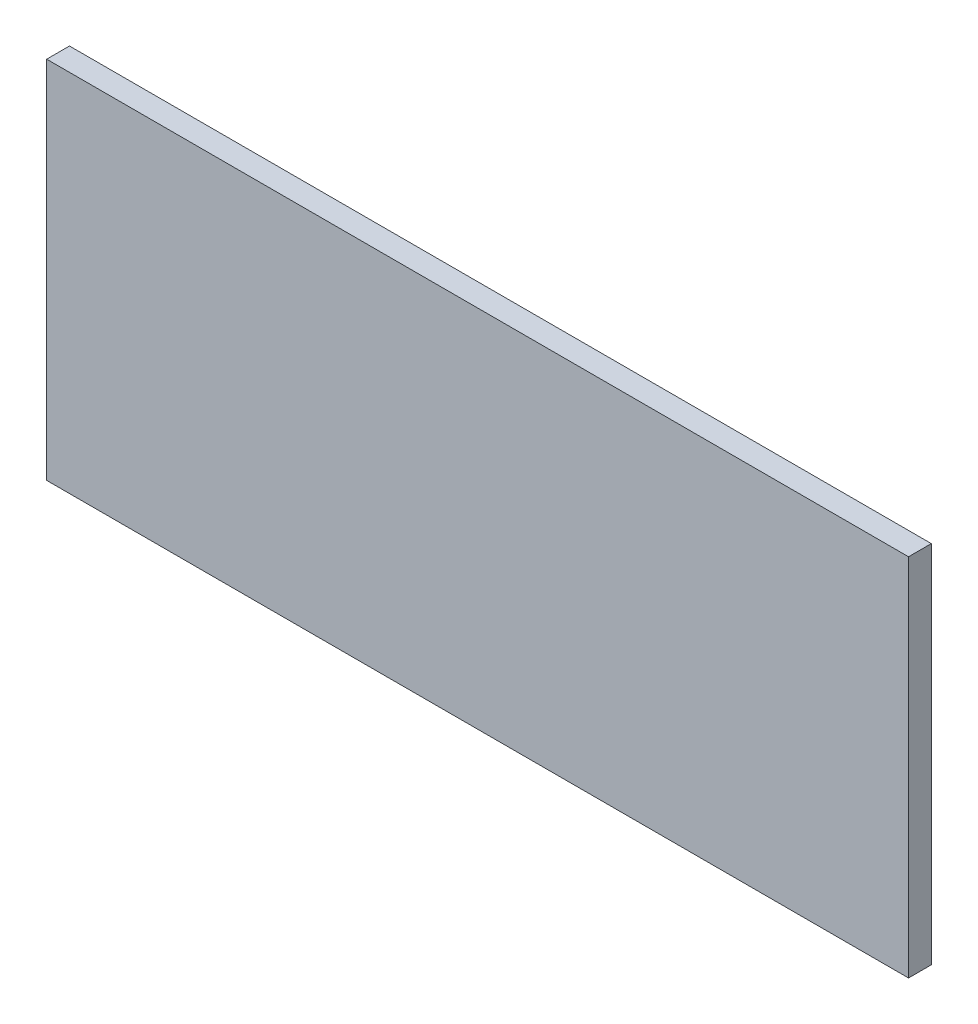
ISO-10303-21;
HEADER;
FILE_DESCRIPTION(('STEP AP214'),'2;1');
FILE_NAME('part.step','',(''),(''),'','','');
FILE_SCHEMA(('AUTOMOTIVE_DESIGN { 1 0 10303 214 1 1 1 1 }'));
ENDSEC;
DATA;
#1=APPLICATION_CONTEXT('core data for automotive mechanical design processes');
#2=APPLICATION_PROTOCOL_DEFINITION('international standard','automotive_design',2000,#1);
#3=PRODUCT_CONTEXT('',#1,'mechanical');
#4=PRODUCT('Part','Part','',(#3));
#5=PRODUCT_RELATED_PRODUCT_CATEGORY('part','',(#4));
#6=PRODUCT_DEFINITION_FORMATION('','',#4);
#7=PRODUCT_DEFINITION_CONTEXT('part definition',#1,'design');
#8=PRODUCT_DEFINITION('design','',#6,#7);
#9=PRODUCT_DEFINITION_SHAPE('','',#8);
#10=(LENGTH_UNIT() NAMED_UNIT(*) SI_UNIT(.MILLI.,.METRE.));
#11=(NAMED_UNIT(*) PLANE_ANGLE_UNIT() SI_UNIT($,.RADIAN.));
#12=(NAMED_UNIT(*) SI_UNIT($,.STERADIAN.) SOLID_ANGLE_UNIT());
#13=UNCERTAINTY_MEASURE_WITH_UNIT(LENGTH_MEASURE(1.E-05),#10,'distance_accuracy_value','');
#14=(GEOMETRIC_REPRESENTATION_CONTEXT(3) GLOBAL_UNCERTAINTY_ASSIGNED_CONTEXT((#13)) GLOBAL_UNIT_ASSIGNED_CONTEXT((#10,
#11,#12)) REPRESENTATION_CONTEXT('',''));
#15=CARTESIAN_POINT('',(0.,0.,0.));
#16=DIRECTION('',(0.,0.,1.));
#17=DIRECTION('',(1.,0.,0.));
#18=AXIS2_PLACEMENT_3D('',#15,#16,#17);
#19=CARTESIAN_POINT('',(94.5,40.,5.));
#20=DIRECTION('',(-1.,0.,0.));
#21=DIRECTION('',(0.,-1.,0.));
#22=AXIS2_PLACEMENT_3D('',#19,#20,#21);
#23=PLANE('',#22);
#24=DIRECTION('',(0.,1.,0.));
#25=VECTOR('',#24,1.);
#26=CARTESIAN_POINT('',(94.5,40.,0.));
#27=LINE('',#26,#25);
#28=CARTESIAN_POINT('',(94.5,-40.,0.));
#29=VERTEX_POINT('',#28);
#30=CARTESIAN_POINT('',(94.5,40.,0.));
#31=VERTEX_POINT('',#30);
#32=EDGE_CURVE('E113',#29,#31,#27,.T.);
#33=ORIENTED_EDGE('',*,*,#32,.T.);
#34=DIRECTION('',(0.,0.,-1.));
#35=VECTOR('',#34,1.);
#36=CARTESIAN_POINT('',(94.5,40.,5.));
#37=LINE('',#36,#35);
#38=CARTESIAN_POINT('',(94.5,40.,5.));
#39=VERTEX_POINT('',#38);
#40=EDGE_CURVE('E11',#39,#31,#37,.T.);
#41=ORIENTED_EDGE('',*,*,#40,.F.);
#42=DIRECTION('',(0.,1.,0.));
#43=VECTOR('',#42,1.);
#44=CARTESIAN_POINT('',(94.5,40.,5.));
#45=LINE('',#44,#43);
#46=CARTESIAN_POINT('',(94.5,-40.,5.));
#47=VERTEX_POINT('',#46);
#48=EDGE_CURVE('E97',#47,#39,#45,.T.);
#49=ORIENTED_EDGE('',*,*,#48,.F.);
#50=DIRECTION('',(0.,0.,-1.));
#51=VECTOR('',#50,1.);
#52=CARTESIAN_POINT('',(94.5,-40.,5.));
#53=LINE('',#52,#51);
#54=EDGE_CURVE('E109',#47,#29,#53,.T.);
#55=ORIENTED_EDGE('',*,*,#54,.T.);
#56=EDGE_LOOP('',(#33,#41,#49,#55));
#57=FACE_BOUND('',#56,.T.);
#58=ADVANCED_FACE('F45',(#57),#23,.F.);
#59=CARTESIAN_POINT('',(-94.5,40.,5.));
#60=DIRECTION('',(0.,-1.,0.));
#61=DIRECTION('',(1.,0.,0.));
#62=AXIS2_PLACEMENT_3D('',#59,#60,#61);
#63=PLANE('',#62);
#64=DIRECTION('',(-1.,0.,0.));
#65=VECTOR('',#64,1.);
#66=CARTESIAN_POINT('',(-94.5,40.,0.));
#67=LINE('',#66,#65);
#68=CARTESIAN_POINT('',(-94.5,40.,0.));
#69=VERTEX_POINT('',#68);
#70=EDGE_CURVE('E102',#31,#69,#67,.T.);
#71=ORIENTED_EDGE('',*,*,#70,.T.);
#72=DIRECTION('',(0.,0.,-1.));
#73=VECTOR('',#72,1.);
#74=CARTESIAN_POINT('',(-94.5,40.,5.));
#75=LINE('',#74,#73);
#76=CARTESIAN_POINT('',(-94.5,40.,5.));
#77=VERTEX_POINT('',#76);
#78=EDGE_CURVE('E54',#77,#69,#75,.T.);
#79=ORIENTED_EDGE('',*,*,#78,.F.);
#80=DIRECTION('',(-1.,0.,0.));
#81=VECTOR('',#80,1.);
#82=CARTESIAN_POINT('',(-94.5,40.,5.));
#83=LINE('',#82,#81);
#84=EDGE_CURVE('E92',#39,#77,#83,.T.);
#85=ORIENTED_EDGE('',*,*,#84,.F.);
#86=ORIENTED_EDGE('',*,*,#40,.T.);
#87=EDGE_LOOP('',(#71,#79,#85,#86));
#88=FACE_BOUND('',#87,.T.);
#89=ADVANCED_FACE('F101',(#88),#63,.F.);
#90=CARTESIAN_POINT('',(-94.5,40.,5.));
#91=DIRECTION('',(1.,0.,0.));
#92=DIRECTION('',(0.,1.,0.));
#93=AXIS2_PLACEMENT_3D('',#90,#91,#92);
#94=PLANE('',#93);
#95=DIRECTION('',(0.,-1.,0.));
#96=VECTOR('',#95,1.);
#97=CARTESIAN_POINT('',(-94.5,40.,0.));
#98=LINE('',#97,#96);
#99=CARTESIAN_POINT('',(-94.5,-40.,0.));
#100=VERTEX_POINT('',#99);
#101=EDGE_CURVE('E79',#69,#100,#98,.T.);
#102=ORIENTED_EDGE('',*,*,#101,.T.);
#103=DIRECTION('',(0.,0.,-1.));
#104=VECTOR('',#103,1.);
#105=CARTESIAN_POINT('',(-94.5,-40.,5.));
#106=LINE('',#105,#104);
#107=CARTESIAN_POINT('',(-94.5,-40.,5.));
#108=VERTEX_POINT('',#107);
#109=EDGE_CURVE('E104',#108,#100,#106,.T.);
#110=ORIENTED_EDGE('',*,*,#109,.F.);
#111=DIRECTION('',(0.,-1.,0.));
#112=VECTOR('',#111,1.);
#113=CARTESIAN_POINT('',(-94.5,40.,5.));
#114=LINE('',#113,#112);
#115=EDGE_CURVE('E95',#77,#108,#114,.T.);
#116=ORIENTED_EDGE('',*,*,#115,.F.);
#117=ORIENTED_EDGE('',*,*,#78,.T.);
#118=EDGE_LOOP('',(#102,#110,#116,#117));
#119=FACE_BOUND('',#118,.T.);
#120=ADVANCED_FACE('F105',(#119),#94,.F.);
#121=CARTESIAN_POINT('',(-94.5,-40.,5.));
#122=DIRECTION('',(0.,1.,0.));
#123=DIRECTION('',(0.,0.,1.));
#124=AXIS2_PLACEMENT_3D('',#121,#122,#123);
#125=PLANE('',#124);
#126=DIRECTION('',(1.,0.,0.));
#127=VECTOR('',#126,1.);
#128=CARTESIAN_POINT('',(-94.5,-40.,0.));
#129=LINE('',#128,#127);
#130=EDGE_CURVE('E85',#100,#29,#129,.T.);
#131=ORIENTED_EDGE('',*,*,#130,.T.);
#132=ORIENTED_EDGE('',*,*,#54,.F.);
#133=DIRECTION('',(1.,0.,0.));
#134=VECTOR('',#133,1.);
#135=CARTESIAN_POINT('',(-94.5,-40.,5.));
#136=LINE('',#135,#134);
#137=EDGE_CURVE('E62',#108,#47,#136,.T.);
#138=ORIENTED_EDGE('',*,*,#137,.F.);
#139=ORIENTED_EDGE('',*,*,#109,.T.);
#140=EDGE_LOOP('',(#131,#132,#138,#139));
#141=FACE_BOUND('',#140,.T.);
#142=ADVANCED_FACE('F126',(#141),#125,.F.);
#143=CARTESIAN_POINT('',(0.,0.,5.));
#144=DIRECTION('',(0.,0.,1.));
#145=DIRECTION('',(1.,0.,0.));
#146=AXIS2_PLACEMENT_3D('',#143,#144,#145);
#147=PLANE('',#146);
#148=ORIENTED_EDGE('',*,*,#48,.T.);
#149=ORIENTED_EDGE('',*,*,#84,.T.);
#150=ORIENTED_EDGE('',*,*,#115,.T.);
#151=ORIENTED_EDGE('',*,*,#137,.T.);
#152=EDGE_LOOP('',(#148,#149,#150,#151));
#153=FACE_BOUND('',#152,.T.);
#154=ADVANCED_FACE('F93',(#153),#147,.T.);
#155=CARTESIAN_POINT('',(0.,0.,0.));
#156=DIRECTION('',(0.,0.,1.));
#157=DIRECTION('',(1.,0.,0.));
#158=AXIS2_PLACEMENT_3D('',#155,#156,#157);
#159=PLANE('',#158);
#160=ORIENTED_EDGE('',*,*,#32,.F.);
#161=ORIENTED_EDGE('',*,*,#130,.F.);
#162=ORIENTED_EDGE('',*,*,#101,.F.);
#163=ORIENTED_EDGE('',*,*,#70,.F.);
#164=EDGE_LOOP('',(#160,#161,#162,#163));
#165=FACE_BOUND('',#164,.T.);
#166=ADVANCED_FACE('F129',(#165),#159,.F.);
#167=CLOSED_SHELL('',(#58,#89,#120,#142,#154,#166));
#168=MANIFOLD_SOLID_BREP('B2',#167);
#169=ADVANCED_BREP_SHAPE_REPRESENTATION('',(#18,#168),#14);
#170=SHAPE_DEFINITION_REPRESENTATION(#9,#169);
ENDSEC;
END-ISO-10303-21;
